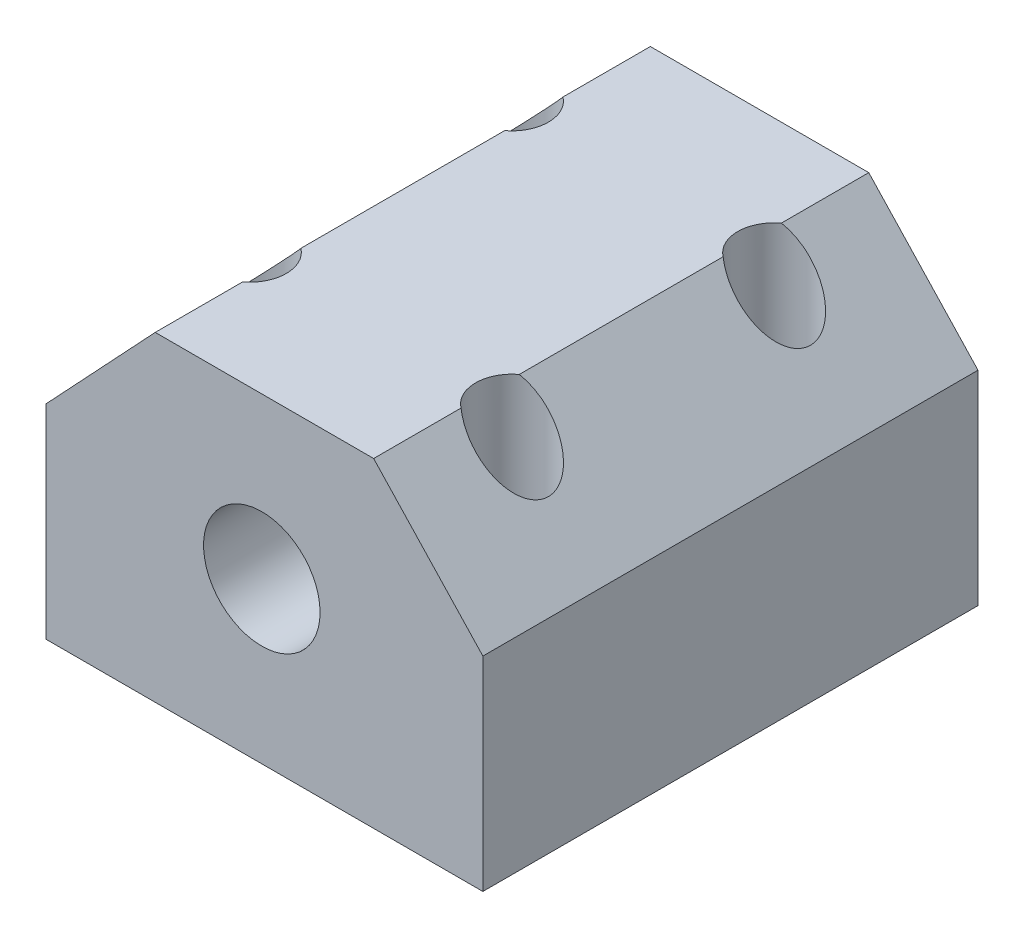
ISO-10303-21;
HEADER;
FILE_DESCRIPTION(('STEP AP214'),'2;1');
FILE_NAME('part.step','',(''),(''),'','','');
FILE_SCHEMA(('AUTOMOTIVE_DESIGN { 1 0 10303 214 1 1 1 1 }'));
ENDSEC;
DATA;
#1=APPLICATION_CONTEXT('core data for automotive mechanical design processes');
#2=APPLICATION_PROTOCOL_DEFINITION('international standard','automotive_design',2000,#1);
#3=PRODUCT_CONTEXT('',#1,'mechanical');
#4=PRODUCT('Part','Part','',(#3));
#5=PRODUCT_RELATED_PRODUCT_CATEGORY('part','',(#4));
#6=PRODUCT_DEFINITION_FORMATION('','',#4);
#7=PRODUCT_DEFINITION_CONTEXT('part definition',#1,'design');
#8=PRODUCT_DEFINITION('design','',#6,#7);
#9=PRODUCT_DEFINITION_SHAPE('','',#8);
#10=(LENGTH_UNIT() NAMED_UNIT(*) SI_UNIT(.MILLI.,.METRE.));
#11=(NAMED_UNIT(*) PLANE_ANGLE_UNIT() SI_UNIT($,.RADIAN.));
#12=(NAMED_UNIT(*) SI_UNIT($,.STERADIAN.) SOLID_ANGLE_UNIT());
#13=UNCERTAINTY_MEASURE_WITH_UNIT(LENGTH_MEASURE(1.E-05),#10,'distance_accuracy_value','');
#14=(GEOMETRIC_REPRESENTATION_CONTEXT(3) GLOBAL_UNCERTAINTY_ASSIGNED_CONTEXT((#13)) GLOBAL_UNIT_ASSIGNED_CONTEXT((#10,
#11,#12)) REPRESENTATION_CONTEXT('',''));
#15=CARTESIAN_POINT('',(0.,0.,0.));
#16=DIRECTION('',(0.,0.,1.));
#17=DIRECTION('',(1.,0.,0.));
#18=AXIS2_PLACEMENT_3D('',#15,#16,#17);
#19=CARTESIAN_POINT('',(0.,22.,0.));
#20=DIRECTION('',(1.,0.,0.));
#21=DIRECTION('',(0.,0.,-1.));
#22=AXIS2_PLACEMENT_3D('',#19,#20,#21);
#23=PLANE('',#22);
#24=DIRECTION('',(0.,-1.,0.));
#25=VECTOR('',#24,1.);
#26=CARTESIAN_POINT('',(0.,22.,0.));
#27=LINE('',#26,#25);
#28=CARTESIAN_POINT('',(0.,14.,0.));
#29=VERTEX_POINT('',#28);
#30=CARTESIAN_POINT('',(0.,0.,0.));
#31=VERTEX_POINT('',#30);
#32=EDGE_CURVE('E162',#29,#31,#27,.T.);
#33=ORIENTED_EDGE('',*,*,#32,.F.);
#34=DIRECTION('',(0.,0.,1.));
#35=VECTOR('',#34,1.);
#36=CARTESIAN_POINT('',(0.,14.,-34.001));
#37=LINE('',#36,#35);
#38=CARTESIAN_POINT('',(0.,14.,-34.));
#39=VERTEX_POINT('',#38);
#40=EDGE_CURVE('E126',#39,#29,#37,.T.);
#41=ORIENTED_EDGE('',*,*,#40,.F.);
#42=DIRECTION('',(0.,-1.,0.));
#43=VECTOR('',#42,1.);
#44=CARTESIAN_POINT('',(0.,22.,-34.));
#45=LINE('',#44,#43);
#46=CARTESIAN_POINT('',(0.,0.,-34.));
#47=VERTEX_POINT('',#46);
#48=EDGE_CURVE('E146',#39,#47,#45,.T.);
#49=ORIENTED_EDGE('',*,*,#48,.T.);
#50=DIRECTION('',(0.,0.,1.));
#51=VECTOR('',#50,1.);
#52=CARTESIAN_POINT('',(0.,0.,0.));
#53=LINE('',#52,#51);
#54=EDGE_CURVE('E139',#47,#31,#53,.T.);
#55=ORIENTED_EDGE('',*,*,#54,.T.);
#56=EDGE_LOOP('',(#33,#41,#49,#55));
#57=FACE_BOUND('',#56,.T.);
#58=ADVANCED_FACE('F33',(#57),#23,.F.);
#59=CARTESIAN_POINT('',(0.,22.,0.));
#60=DIRECTION('',(0.,0.,-1.));
#61=DIRECTION('',(-1.,0.,0.));
#62=AXIS2_PLACEMENT_3D('',#59,#60,#61);
#63=PLANE('',#62);
#64=CARTESIAN_POINT('',(14.820555819087,11.,0.));
#65=DIRECTION('',(0.,0.,1.));
#66=DIRECTION('',(1.,0.,0.));
#67=AXIS2_PLACEMENT_3D('',#64,#65,#66);
#68=CIRCLE('',#67,4.);
#69=CARTESIAN_POINT('',(18.820555819087,11.,0.));
#70=VERTEX_POINT('',#69);
#71=EDGE_CURVE('E133',#70,#70,#68,.T.);
#72=ORIENTED_EDGE('',*,*,#71,.F.);
#73=EDGE_LOOP('',(#72));
#74=FACE_BOUND('',#73,.T.);
#75=DIRECTION('',(0.,-1.,0.));
#76=VECTOR('',#75,1.);
#77=CARTESIAN_POINT('',(30.,22.,0.));
#78=LINE('',#77,#76);
#79=CARTESIAN_POINT('',(30.,14.,0.));
#80=VERTEX_POINT('',#79);
#81=CARTESIAN_POINT('',(30.,0.,0.));
#82=VERTEX_POINT('',#81);
#83=EDGE_CURVE('E160',#80,#82,#78,.T.);
#84=ORIENTED_EDGE('',*,*,#83,.F.);
#85=DIRECTION('',(0.68394112888133,-0.729537204140085,0.));
#86=VECTOR('',#85,1.);
#87=CARTESIAN_POINT('',(30.,14.,0.));
#88=LINE('',#87,#86);
#89=CARTESIAN_POINT('',(22.5,22.,0.));
#90=VERTEX_POINT('',#89);
#91=EDGE_CURVE('E180',#90,#80,#88,.T.);
#92=ORIENTED_EDGE('',*,*,#91,.F.);
#93=DIRECTION('',(1.,0.,0.));
#94=VECTOR('',#93,1.);
#95=CARTESIAN_POINT('',(0.,22.,0.));
#96=LINE('',#95,#94);
#97=CARTESIAN_POINT('',(7.5,22.,0.));
#98=VERTEX_POINT('',#97);
#99=EDGE_CURVE('E140',#98,#90,#96,.T.);
#100=ORIENTED_EDGE('',*,*,#99,.F.);
#101=DIRECTION('',(0.68394112888133,0.729537204140085,0.));
#102=VECTOR('',#101,1.);
#103=CARTESIAN_POINT('',(0.,14.,0.));
#104=LINE('',#103,#102);
#105=EDGE_CURVE('E129',#29,#98,#104,.T.);
#106=ORIENTED_EDGE('',*,*,#105,.F.);
#107=ORIENTED_EDGE('',*,*,#32,.T.);
#108=DIRECTION('',(1.,0.,0.));
#109=VECTOR('',#108,1.);
#110=CARTESIAN_POINT('',(0.,0.,0.));
#111=LINE('',#110,#109);
#112=EDGE_CURVE('E149',#31,#82,#111,.T.);
#113=ORIENTED_EDGE('',*,*,#112,.T.);
#114=EDGE_LOOP('',(#84,#92,#100,#106,#107,#113));
#115=FACE_BOUND('',#114,.T.);
#116=ADVANCED_FACE('F233',(#74,#115),#63,.F.);
#117=CARTESIAN_POINT('',(30.,22.,0.));
#118=DIRECTION('',(-1.,0.,0.));
#119=DIRECTION('',(0.,0.,1.));
#120=AXIS2_PLACEMENT_3D('',#117,#118,#119);
#121=PLANE('',#120);
#122=DIRECTION('',(0.,-1.,0.));
#123=VECTOR('',#122,1.);
#124=CARTESIAN_POINT('',(30.,22.,-34.));
#125=LINE('',#124,#123);
#126=CARTESIAN_POINT('',(30.,14.,-34.));
#127=VERTEX_POINT('',#126);
#128=CARTESIAN_POINT('',(30.,0.,-34.));
#129=VERTEX_POINT('',#128);
#130=EDGE_CURVE('E158',#127,#129,#125,.T.);
#131=ORIENTED_EDGE('',*,*,#130,.F.);
#132=DIRECTION('',(0.,0.,1.));
#133=VECTOR('',#132,1.);
#134=CARTESIAN_POINT('',(30.,14.,-34.001));
#135=LINE('',#134,#133);
#136=EDGE_CURVE('E179',#127,#80,#135,.T.);
#137=ORIENTED_EDGE('',*,*,#136,.T.);
#138=ORIENTED_EDGE('',*,*,#83,.T.);
#139=DIRECTION('',(0.,0.,-1.));
#140=VECTOR('',#139,1.);
#141=CARTESIAN_POINT('',(30.,0.,0.));
#142=LINE('',#141,#140);
#143=EDGE_CURVE('E152',#82,#129,#142,.T.);
#144=ORIENTED_EDGE('',*,*,#143,.T.);
#145=EDGE_LOOP('',(#131,#137,#138,#144));
#146=FACE_BOUND('',#145,.T.);
#147=ADVANCED_FACE('F229',(#146),#121,.F.);
#148=CARTESIAN_POINT('',(0.,22.,-34.));
#149=DIRECTION('',(0.,0.,1.));
#150=DIRECTION('',(1.,0.,0.));
#151=AXIS2_PLACEMENT_3D('',#148,#149,#150);
#152=PLANE('',#151);
#153=CARTESIAN_POINT('',(14.820555819087,11.,-34.));
#154=DIRECTION('',(0.,0.,1.));
#155=DIRECTION('',(1.,0.,0.));
#156=AXIS2_PLACEMENT_3D('',#153,#154,#155);
#157=CIRCLE('',#156,4.);
#158=CARTESIAN_POINT('',(18.820555819087,11.,-34.));
#159=VERTEX_POINT('',#158);
#160=EDGE_CURVE('E136',#159,#159,#157,.F.);
#161=ORIENTED_EDGE('',*,*,#160,.F.);
#162=EDGE_LOOP('',(#161));
#163=FACE_BOUND('',#162,.T.);
#164=DIRECTION('',(-1.,0.,0.));
#165=VECTOR('',#164,1.);
#166=CARTESIAN_POINT('',(0.,22.,-34.));
#167=LINE('',#166,#165);
#168=CARTESIAN_POINT('',(22.5,22.,-34.));
#169=VERTEX_POINT('',#168);
#170=CARTESIAN_POINT('',(7.5,22.,-34.));
#171=VERTEX_POINT('',#170);
#172=EDGE_CURVE('E143',#169,#171,#167,.T.);
#173=ORIENTED_EDGE('',*,*,#172,.F.);
#174=DIRECTION('',(-0.68394112888133,0.729537204140085,0.));
#175=VECTOR('',#174,1.);
#176=CARTESIAN_POINT('',(30.,14.,-34.));
#177=LINE('',#176,#175);
#178=EDGE_CURVE('E185',#127,#169,#177,.T.);
#179=ORIENTED_EDGE('',*,*,#178,.F.);
#180=ORIENTED_EDGE('',*,*,#130,.T.);
#181=DIRECTION('',(-1.,0.,0.));
#182=VECTOR('',#181,1.);
#183=CARTESIAN_POINT('',(0.,0.,-34.));
#184=LINE('',#183,#182);
#185=EDGE_CURVE('E144',#129,#47,#184,.T.);
#186=ORIENTED_EDGE('',*,*,#185,.T.);
#187=ORIENTED_EDGE('',*,*,#48,.F.);
#188=DIRECTION('',(-0.68394112888133,-0.729537204140085,0.));
#189=VECTOR('',#188,1.);
#190=CARTESIAN_POINT('',(0.,14.,-34.));
#191=LINE('',#190,#189);
#192=EDGE_CURVE('E125',#171,#39,#191,.T.);
#193=ORIENTED_EDGE('',*,*,#192,.F.);
#194=EDGE_LOOP('',(#173,#179,#180,#186,#187,#193));
#195=FACE_BOUND('',#194,.T.);
#196=ADVANCED_FACE('F225',(#163,#195),#152,.F.);
#197=CARTESIAN_POINT('',(0.,22.,0.));
#198=DIRECTION('',(0.,-1.,0.));
#199=DIRECTION('',(0.,0.,-1.));
#200=AXIS2_PLACEMENT_3D('',#197,#198,#199);
#201=PLANE('',#200);
#202=DIRECTION('',(0.,0.,1.));
#203=VECTOR('',#202,1.);
#204=CARTESIAN_POINT('',(7.5,22.,-34.001));
#205=LINE('',#204,#203);
#206=CARTESIAN_POINT('',(7.5,22.,-28.));
#207=VERTEX_POINT('',#206);
#208=EDGE_CURVE('E115',#171,#207,#205,.T.);
#209=ORIENTED_EDGE('',*,*,#208,.T.);
#210=CARTESIAN_POINT('',(6.,22.,-26.));
#211=DIRECTION('',(0.,-1.,0.));
#212=DIRECTION('',(0.,0.,-1.));
#213=AXIS2_PLACEMENT_3D('',#210,#211,#212);
#214=CIRCLE('',#213,2.5);
#215=CARTESIAN_POINT('',(7.5,22.,-24.));
#216=VERTEX_POINT('',#215);
#217=EDGE_CURVE('E46',#207,#216,#214,.T.);
#218=ORIENTED_EDGE('',*,*,#217,.T.);
#219=CARTESIAN_POINT('',(7.5,22.,-10.));
#220=VERTEX_POINT('',#219);
#221=EDGE_CURVE('E113',#216,#220,#205,.T.);
#222=ORIENTED_EDGE('',*,*,#221,.T.);
#223=CARTESIAN_POINT('',(6.,22.,-8.));
#224=DIRECTION('',(0.,-1.,0.));
#225=DIRECTION('',(0.,0.,-1.));
#226=AXIS2_PLACEMENT_3D('',#223,#224,#225);
#227=CIRCLE('',#226,2.5);
#228=CARTESIAN_POINT('',(7.5,22.,-6.));
#229=VERTEX_POINT('',#228);
#230=EDGE_CURVE('E187',#220,#229,#227,.T.);
#231=ORIENTED_EDGE('',*,*,#230,.T.);
#232=EDGE_CURVE('E123',#229,#98,#205,.T.);
#233=ORIENTED_EDGE('',*,*,#232,.T.);
#234=ORIENTED_EDGE('',*,*,#99,.T.);
#235=DIRECTION('',(0.,0.,1.));
#236=VECTOR('',#235,1.);
#237=CARTESIAN_POINT('',(22.5,22.,-34.001));
#238=LINE('',#237,#236);
#239=CARTESIAN_POINT('',(22.5,22.,-6.00000000000001));
#240=VERTEX_POINT('',#239);
#241=EDGE_CURVE('E178',#240,#90,#238,.T.);
#242=ORIENTED_EDGE('',*,*,#241,.F.);
#243=CARTESIAN_POINT('',(24.,22.,-8.));
#244=DIRECTION('',(0.,-1.,0.));
#245=DIRECTION('',(0.,0.,-1.));
#246=AXIS2_PLACEMENT_3D('',#243,#244,#245);
#247=CIRCLE('',#246,2.5);
#248=CARTESIAN_POINT('',(22.5,22.,-10.));
#249=VERTEX_POINT('',#248);
#250=EDGE_CURVE('E177',#240,#249,#247,.T.);
#251=ORIENTED_EDGE('',*,*,#250,.T.);
#252=CARTESIAN_POINT('',(22.5,22.,-24.));
#253=VERTEX_POINT('',#252);
#254=EDGE_CURVE('E171',#253,#249,#238,.T.);
#255=ORIENTED_EDGE('',*,*,#254,.F.);
#256=CARTESIAN_POINT('',(24.,22.,-26.));
#257=DIRECTION('',(0.,-1.,0.));
#258=DIRECTION('',(0.,0.,-1.));
#259=AXIS2_PLACEMENT_3D('',#256,#257,#258);
#260=CIRCLE('',#259,2.5);
#261=CARTESIAN_POINT('',(22.5,22.,-28.));
#262=VERTEX_POINT('',#261);
#263=EDGE_CURVE('E52',#253,#262,#260,.T.);
#264=ORIENTED_EDGE('',*,*,#263,.T.);
#265=EDGE_CURVE('E174',#169,#262,#238,.T.);
#266=ORIENTED_EDGE('',*,*,#265,.F.);
#267=ORIENTED_EDGE('',*,*,#172,.T.);
#268=EDGE_LOOP('',(#209,#218,#222,#231,#233,#234,#242,#251,#255,#264,#266,#267));
#269=FACE_BOUND('',#268,.T.);
#270=ADVANCED_FACE('F111',(#269),#201,.F.);
#271=CARTESIAN_POINT('',(0.,0.,0.));
#272=DIRECTION('',(0.,-1.,0.));
#273=DIRECTION('',(0.,0.,-1.));
#274=AXIS2_PLACEMENT_3D('',#271,#272,#273);
#275=PLANE('',#274);
#276=CARTESIAN_POINT('',(6.,0.,-26.));
#277=DIRECTION('',(0.,-1.,0.));
#278=DIRECTION('',(0.,0.,-1.));
#279=AXIS2_PLACEMENT_3D('',#276,#277,#278);
#280=CIRCLE('',#279,2.5);
#281=CARTESIAN_POINT('',(6.,0.,-28.5));
#282=VERTEX_POINT('',#281);
#283=EDGE_CURVE('E117',#282,#282,#280,.T.);
#284=ORIENTED_EDGE('',*,*,#283,.F.);
#285=EDGE_LOOP('',(#284));
#286=FACE_BOUND('',#285,.T.);
#287=CARTESIAN_POINT('',(24.,0.,-26.));
#288=DIRECTION('',(0.,-1.,0.));
#289=DIRECTION('',(0.,0.,-1.));
#290=AXIS2_PLACEMENT_3D('',#287,#288,#289);
#291=CIRCLE('',#290,2.5);
#292=CARTESIAN_POINT('',(24.,0.,-28.5));
#293=VERTEX_POINT('',#292);
#294=EDGE_CURVE('E116',#293,#293,#291,.T.);
#295=ORIENTED_EDGE('',*,*,#294,.F.);
#296=EDGE_LOOP('',(#295));
#297=FACE_BOUND('',#296,.T.);
#298=CARTESIAN_POINT('',(24.,0.,-8.));
#299=DIRECTION('',(0.,-1.,0.));
#300=DIRECTION('',(0.,0.,-1.));
#301=AXIS2_PLACEMENT_3D('',#298,#299,#300);
#302=CIRCLE('',#301,2.5);
#303=CARTESIAN_POINT('',(24.,0.,-10.5));
#304=VERTEX_POINT('',#303);
#305=EDGE_CURVE('E192',#304,#304,#302,.T.);
#306=ORIENTED_EDGE('',*,*,#305,.F.);
#307=EDGE_LOOP('',(#306));
#308=FACE_BOUND('',#307,.T.);
#309=CARTESIAN_POINT('',(6.,0.,-8.));
#310=DIRECTION('',(0.,-1.,0.));
#311=DIRECTION('',(0.,0.,-1.));
#312=AXIS2_PLACEMENT_3D('',#309,#310,#311);
#313=CIRCLE('',#312,2.5);
#314=CARTESIAN_POINT('',(6.,0.,-10.5));
#315=VERTEX_POINT('',#314);
#316=EDGE_CURVE('E188',#315,#315,#313,.T.);
#317=ORIENTED_EDGE('',*,*,#316,.F.);
#318=EDGE_LOOP('',(#317));
#319=FACE_BOUND('',#318,.T.);
#320=ORIENTED_EDGE('',*,*,#54,.F.);
#321=ORIENTED_EDGE('',*,*,#185,.F.);
#322=ORIENTED_EDGE('',*,*,#143,.F.);
#323=ORIENTED_EDGE('',*,*,#112,.F.);
#324=EDGE_LOOP('',(#320,#321,#322,#323));
#325=FACE_BOUND('',#324,.T.);
#326=ADVANCED_FACE('F203',(#286,#297,#308,#319,#325),#275,.T.);
#327=CARTESIAN_POINT('',(14.820555819087,11.,-34.001));
#328=DIRECTION('',(0.,0.,1.));
#329=DIRECTION('',(1.,0.,0.));
#330=AXIS2_PLACEMENT_3D('',#327,#328,#329);
#331=CYLINDRICAL_SURFACE('',#330,4.);
#332=ORIENTED_EDGE('',*,*,#71,.T.);
#333=EDGE_LOOP('',(#332));
#334=FACE_BOUND('',#333,.T.);
#335=ORIENTED_EDGE('',*,*,#160,.T.);
#336=EDGE_LOOP('',(#335));
#337=FACE_BOUND('',#336,.T.);
#338=ADVANCED_FACE('F206',(#334,#337),#331,.F.);
#339=CARTESIAN_POINT('',(0.,14.,-34.001));
#340=DIRECTION('',(0.729537204140085,-0.68394112888133,0.));
#341=DIRECTION('',(0.68394112888133,0.729537204140085,0.));
#342=AXIS2_PLACEMENT_3D('',#339,#340,#341);
#343=PLANE('',#342);
#344=ORIENTED_EDGE('',*,*,#221,.F.);
#345=CARTESIAN_POINT('',(6.,20.4,-26.));
#346=DIRECTION('',(0.729537204140085,-0.68394112888133,0.));
#347=DIRECTION('',(-0.68394112888133,-0.729537204140085,0.));
#348=AXIS2_PLACEMENT_3D('',#345,#346,#347);
#349=ELLIPSE('',#348,3.65528536657688,2.5);
#350=EDGE_CURVE('E11',#216,#207,#349,.T.);
#351=ORIENTED_EDGE('',*,*,#350,.T.);
#352=ORIENTED_EDGE('',*,*,#208,.F.);
#353=ORIENTED_EDGE('',*,*,#192,.T.);
#354=ORIENTED_EDGE('',*,*,#40,.T.);
#355=ORIENTED_EDGE('',*,*,#105,.T.);
#356=ORIENTED_EDGE('',*,*,#232,.F.);
#357=CARTESIAN_POINT('',(6.,20.4,-8.));
#358=DIRECTION('',(0.729537204140085,-0.68394112888133,0.));
#359=DIRECTION('',(-0.68394112888133,-0.729537204140085,0.));
#360=AXIS2_PLACEMENT_3D('',#357,#358,#359);
#361=ELLIPSE('',#360,3.65528536657689,2.5);
#362=EDGE_CURVE('E122',#229,#220,#361,.T.);
#363=ORIENTED_EDGE('',*,*,#362,.T.);
#364=EDGE_LOOP('',(#344,#351,#352,#353,#354,#355,#356,#363));
#365=FACE_BOUND('',#364,.T.);
#366=ADVANCED_FACE('F120',(#365),#343,.F.);
#367=CARTESIAN_POINT('',(30.,14.,-34.001));
#368=DIRECTION('',(-0.729537204140085,-0.68394112888133,0.));
#369=DIRECTION('',(0.68394112888133,-0.729537204140085,0.));
#370=AXIS2_PLACEMENT_3D('',#367,#368,#369);
#371=PLANE('',#370);
#372=ORIENTED_EDGE('',*,*,#265,.T.);
#373=CARTESIAN_POINT('',(24.,20.4,-26.));
#374=DIRECTION('',(-0.729537204140085,-0.68394112888133,0.));
#375=DIRECTION('',(0.68394112888133,-0.729537204140085,0.));
#376=AXIS2_PLACEMENT_3D('',#373,#374,#375);
#377=ELLIPSE('',#376,3.65528536657688,2.5);
#378=EDGE_CURVE('E40',#262,#253,#377,.T.);
#379=ORIENTED_EDGE('',*,*,#378,.T.);
#380=ORIENTED_EDGE('',*,*,#254,.T.);
#381=CARTESIAN_POINT('',(24.,20.4,-8.));
#382=DIRECTION('',(-0.729537204140085,-0.68394112888133,0.));
#383=DIRECTION('',(0.68394112888133,-0.729537204140085,0.));
#384=AXIS2_PLACEMENT_3D('',#381,#382,#383);
#385=ELLIPSE('',#384,3.65528536657688,2.5);
#386=EDGE_CURVE('E165',#249,#240,#385,.T.);
#387=ORIENTED_EDGE('',*,*,#386,.T.);
#388=ORIENTED_EDGE('',*,*,#241,.T.);
#389=ORIENTED_EDGE('',*,*,#91,.T.);
#390=ORIENTED_EDGE('',*,*,#136,.F.);
#391=ORIENTED_EDGE('',*,*,#178,.T.);
#392=EDGE_LOOP('',(#372,#379,#380,#387,#388,#389,#390,#391));
#393=FACE_BOUND('',#392,.T.);
#394=ADVANCED_FACE('F170',(#393),#371,.F.);
#395=CARTESIAN_POINT('',(6.,22.,-8.));
#396=DIRECTION('',(0.,-1.,0.));
#397=DIRECTION('',(0.,0.,-1.));
#398=AXIS2_PLACEMENT_3D('',#395,#396,#397);
#399=CYLINDRICAL_SURFACE('',#398,2.5);
#400=ORIENTED_EDGE('',*,*,#316,.T.);
#401=EDGE_LOOP('',(#400));
#402=FACE_BOUND('',#401,.T.);
#403=ORIENTED_EDGE('',*,*,#230,.F.);
#404=ORIENTED_EDGE('',*,*,#362,.F.);
#405=EDGE_LOOP('',(#403,#404));
#406=FACE_BOUND('',#405,.T.);
#407=ADVANCED_FACE('F238',(#402,#406),#399,.F.);
#408=CARTESIAN_POINT('',(24.,22.,-8.));
#409=DIRECTION('',(0.,-1.,0.));
#410=DIRECTION('',(0.,0.,-1.));
#411=AXIS2_PLACEMENT_3D('',#408,#409,#410);
#412=CYLINDRICAL_SURFACE('',#411,2.5);
#413=ORIENTED_EDGE('',*,*,#305,.T.);
#414=EDGE_LOOP('',(#413));
#415=FACE_BOUND('',#414,.T.);
#416=ORIENTED_EDGE('',*,*,#250,.F.);
#417=ORIENTED_EDGE('',*,*,#386,.F.);
#418=EDGE_LOOP('',(#416,#417));
#419=FACE_BOUND('',#418,.T.);
#420=ADVANCED_FACE('F240',(#415,#419),#412,.F.);
#421=CARTESIAN_POINT('',(24.,22.,-26.));
#422=DIRECTION('',(0.,-1.,0.));
#423=DIRECTION('',(0.,0.,-1.));
#424=AXIS2_PLACEMENT_3D('',#421,#422,#423);
#425=CYLINDRICAL_SURFACE('',#424,2.5);
#426=ORIENTED_EDGE('',*,*,#294,.T.);
#427=EDGE_LOOP('',(#426));
#428=FACE_BOUND('',#427,.T.);
#429=ORIENTED_EDGE('',*,*,#263,.F.);
#430=ORIENTED_EDGE('',*,*,#378,.F.);
#431=EDGE_LOOP('',(#429,#430));
#432=FACE_BOUND('',#431,.T.);
#433=ADVANCED_FACE('F247',(#428,#432),#425,.F.);
#434=CARTESIAN_POINT('',(6.,22.,-26.));
#435=DIRECTION('',(0.,-1.,0.));
#436=DIRECTION('',(0.,0.,-1.));
#437=AXIS2_PLACEMENT_3D('',#434,#435,#436);
#438=CYLINDRICAL_SURFACE('',#437,2.5);
#439=ORIENTED_EDGE('',*,*,#283,.T.);
#440=EDGE_LOOP('',(#439));
#441=FACE_BOUND('',#440,.T.);
#442=ORIENTED_EDGE('',*,*,#217,.F.);
#443=ORIENTED_EDGE('',*,*,#350,.F.);
#444=EDGE_LOOP('',(#442,#443));
#445=FACE_BOUND('',#444,.T.);
#446=ADVANCED_FACE('F105',(#441,#445),#438,.F.);
#447=CLOSED_SHELL('',(#58,#116,#147,#196,#270,#326,#338,#366,#394,#407,#420,#433,#446));
#448=MANIFOLD_SOLID_BREP('B2',#447);
#449=ADVANCED_BREP_SHAPE_REPRESENTATION('',(#18,#448),#14);
#450=SHAPE_DEFINITION_REPRESENTATION(#9,#449);
ENDSEC;
END-ISO-10303-21;
